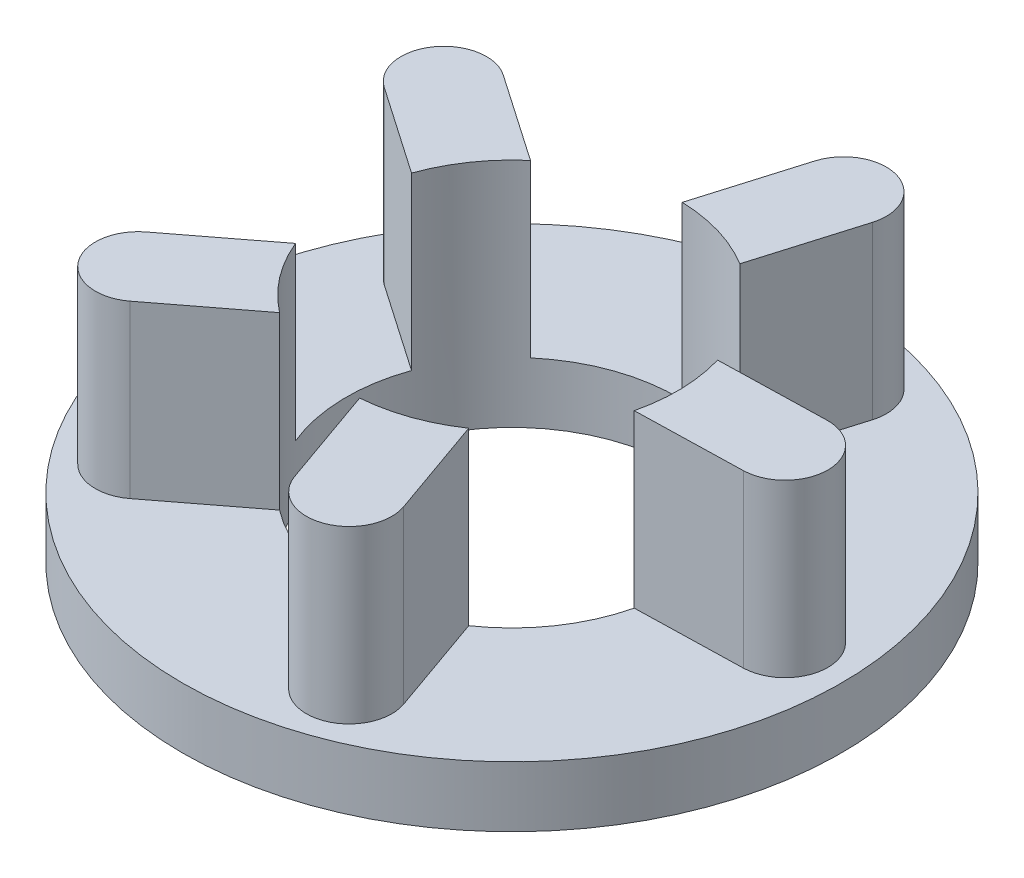
ISO-10303-21;
HEADER;
FILE_DESCRIPTION(('STEP AP214'),'2;1');
FILE_NAME('part.step','',(''),(''),'','','');
FILE_SCHEMA(('AUTOMOTIVE_DESIGN { 1 0 10303 214 1 1 1 1 }'));
ENDSEC;
DATA;
#1=APPLICATION_CONTEXT('core data for automotive mechanical design processes');
#2=APPLICATION_PROTOCOL_DEFINITION('international standard','automotive_design',2000,#1);
#3=PRODUCT_CONTEXT('',#1,'mechanical');
#4=PRODUCT('Part','Part','',(#3));
#5=PRODUCT_RELATED_PRODUCT_CATEGORY('part','',(#4));
#6=PRODUCT_DEFINITION_FORMATION('','',#4);
#7=PRODUCT_DEFINITION_CONTEXT('part definition',#1,'design');
#8=PRODUCT_DEFINITION('design','',#6,#7);
#9=PRODUCT_DEFINITION_SHAPE('','',#8);
#10=(LENGTH_UNIT() NAMED_UNIT(*) SI_UNIT(.MILLI.,.METRE.));
#11=(NAMED_UNIT(*) PLANE_ANGLE_UNIT() SI_UNIT($,.RADIAN.));
#12=(NAMED_UNIT(*) SI_UNIT($,.STERADIAN.) SOLID_ANGLE_UNIT());
#13=UNCERTAINTY_MEASURE_WITH_UNIT(LENGTH_MEASURE(1.E-05),#10,'distance_accuracy_value','');
#14=(GEOMETRIC_REPRESENTATION_CONTEXT(3) GLOBAL_UNCERTAINTY_ASSIGNED_CONTEXT((#13)) GLOBAL_UNIT_ASSIGNED_CONTEXT((#10,
#11,#12)) REPRESENTATION_CONTEXT('',''));
#15=CARTESIAN_POINT('',(0.,0.,0.));
#16=DIRECTION('',(0.,0.,1.));
#17=DIRECTION('',(1.,0.,0.));
#18=AXIS2_PLACEMENT_3D('',#15,#16,#17);
#19=CARTESIAN_POINT('',(-0.729172585778251,4.8,-0.953051593645096));
#20=DIRECTION('',(-0.607643821481876,0.,-0.794209661370914));
#21=DIRECTION('',(-0.794209661370914,0.,0.607643821481876));
#22=AXIS2_PLACEMENT_3D('',#19,#20,#21);
#23=PLANE('',#22);
#24=DIRECTION('',(0.794209661370914,0.,-0.607643821481876));
#25=VECTOR('',#24,1.);
#26=CARTESIAN_POINT('',(-0.729172585778251,0.,-0.953051593645096));
#27=LINE('',#26,#25);
#28=CARTESIAN_POINT('',(-6.67256688237728,0.,3.59419455383332));
#29=VERTEX_POINT('',#28);
#30=CARTESIAN_POINT('',(-4.29715451738641,0.,1.77678447024551));
#31=VERTEX_POINT('',#30);
#32=EDGE_CURVE('E356',#29,#31,#27,.T.);
#33=ORIENTED_EDGE('',*,*,#32,.F.);
#34=DIRECTION('',(0.,-1.,0.));
#35=VECTOR('',#34,1.);
#36=CARTESIAN_POINT('',(-6.67256688237728,4.8,3.59419455383332));
#37=LINE('',#36,#35);
#38=CARTESIAN_POINT('',(-6.67256688237728,4.8,3.59419455383332));
#39=VERTEX_POINT('',#38);
#40=EDGE_CURVE('E11',#39,#29,#37,.T.);
#41=ORIENTED_EDGE('',*,*,#40,.F.);
#42=DIRECTION('',(0.794209661370914,0.,-0.607643821481876));
#43=VECTOR('',#42,1.);
#44=CARTESIAN_POINT('',(-0.729172585778251,4.8,-0.953051593645096));
#45=LINE('',#44,#43);
#46=CARTESIAN_POINT('',(-4.29715451738641,4.8,1.77678447024551));
#47=VERTEX_POINT('',#46);
#48=EDGE_CURVE('E365',#39,#47,#45,.T.);
#49=ORIENTED_EDGE('',*,*,#48,.T.);
#50=DIRECTION('',(0.,-1.,0.));
#51=VECTOR('',#50,1.);
#52=CARTESIAN_POINT('',(-4.29715451738641,4.8,1.77678447024551));
#53=LINE('',#52,#51);
#54=EDGE_CURVE('E380',#47,#31,#53,.T.);
#55=ORIENTED_EDGE('',*,*,#54,.T.);
#56=EDGE_LOOP('',(#33,#41,#49,#55));
#57=FACE_BOUND('',#56,.T.);
#58=ADVANCED_FACE('F45',(#57),#23,.T.);
#59=CARTESIAN_POINT('',(-5.94339429659903,4.8,4.54724614747841));
#60=DIRECTION('',(0.,-1.,0.));
#61=DIRECTION('',(0.,0.,-1.));
#62=AXIS2_PLACEMENT_3D('',#59,#60,#61);
#63=CYLINDRICAL_SURFACE('',#62,1.2);
#64=CARTESIAN_POINT('',(-5.94339429659903,0.,4.54724614747841));
#65=DIRECTION('',(0.,1.,0.));
#66=DIRECTION('',(0.,0.,1.));
#67=AXIS2_PLACEMENT_3D('',#64,#65,#66);
#68=CIRCLE('',#67,1.2);
#69=CARTESIAN_POINT('',(-5.21422171082078,0.,5.50029774112351));
#70=VERTEX_POINT('',#69);
#71=EDGE_CURVE('E384',#29,#70,#68,.T.);
#72=ORIENTED_EDGE('',*,*,#71,.T.);
#73=DIRECTION('',(0.,-1.,0.));
#74=VECTOR('',#73,1.);
#75=CARTESIAN_POINT('',(-5.21422171082078,4.8,5.50029774112351));
#76=LINE('',#75,#74);
#77=CARTESIAN_POINT('',(-5.21422171082078,4.8,5.50029774112351));
#78=VERTEX_POINT('',#77);
#79=EDGE_CURVE('E53',#78,#70,#76,.T.);
#80=ORIENTED_EDGE('',*,*,#79,.F.);
#81=CARTESIAN_POINT('',(-5.94339429659903,4.8,4.54724614747841));
#82=DIRECTION('',(0.,1.,0.));
#83=DIRECTION('',(0.,0.,1.));
#84=AXIS2_PLACEMENT_3D('',#81,#82,#83);
#85=CIRCLE('',#84,1.2);
#86=EDGE_CURVE('E369',#39,#78,#85,.T.);
#87=ORIENTED_EDGE('',*,*,#86,.F.);
#88=ORIENTED_EDGE('',*,*,#40,.T.);
#89=EDGE_LOOP('',(#72,#80,#87,#88));
#90=FACE_BOUND('',#89,.T.);
#91=ADVANCED_FACE('F406',(#90),#63,.T.);
#92=CARTESIAN_POINT('',(0.729172585778251,4.8,0.953051593645096));
#93=DIRECTION('',(-0.607643821481877,0.,-0.794209661370914));
#94=DIRECTION('',(-0.794209661370914,0.,0.607643821481877));
#95=AXIS2_PLACEMENT_3D('',#92,#93,#94);
#96=PLANE('',#95);
#97=DIRECTION('',(0.794209661370914,0.,-0.607643821481877));
#98=VECTOR('',#97,1.);
#99=CARTESIAN_POINT('',(0.729172585778251,0.,0.953051593645096));
#100=LINE('',#99,#98);
#101=CARTESIAN_POINT('',(-2.8388093458299,0.,3.6828876575357));
#102=VERTEX_POINT('',#101);
#103=EDGE_CURVE('E370',#70,#102,#100,.T.);
#104=ORIENTED_EDGE('',*,*,#103,.T.);
#105=DIRECTION('',(0.,-1.,0.));
#106=VECTOR('',#105,1.);
#107=CARTESIAN_POINT('',(-2.8388093458299,4.8,3.6828876575357));
#108=LINE('',#107,#106);
#109=CARTESIAN_POINT('',(-2.8388093458299,4.8,3.6828876575357));
#110=VERTEX_POINT('',#109);
#111=EDGE_CURVE('E394',#110,#102,#108,.T.);
#112=ORIENTED_EDGE('',*,*,#111,.F.);
#113=DIRECTION('',(0.794209661370914,0.,-0.607643821481877));
#114=VECTOR('',#113,1.);
#115=CARTESIAN_POINT('',(0.729172585778251,4.8,0.953051593645096));
#116=LINE('',#115,#114);
#117=EDGE_CURVE('E373',#78,#110,#116,.T.);
#118=ORIENTED_EDGE('',*,*,#117,.F.);
#119=ORIENTED_EDGE('',*,*,#79,.T.);
#120=EDGE_LOOP('',(#104,#112,#118,#119));
#121=FACE_BOUND('',#120,.T.);
#122=ADVANCED_FACE('F402',(#121),#96,.F.);
#123=CARTESIAN_POINT('',(0.,4.8,0.));
#124=DIRECTION('',(0.,-1.,0.));
#125=DIRECTION('',(0.,0.,-1.));
#126=AXIS2_PLACEMENT_3D('',#123,#124,#125);
#127=CYLINDRICAL_SURFACE('',#126,4.65);
#128=ORIENTED_EDGE('',*,*,#111,.T.);
#129=CARTESIAN_POINT('',(0.,0.,0.));
#130=DIRECTION('',(0.,1.,0.));
#131=DIRECTION('',(0.,0.,1.));
#132=AXIS2_PLACEMENT_3D('',#129,#130,#131);
#133=CIRCLE('',#132,4.65);
#134=CARTESIAN_POINT('',(0.361928675151548,0.,4.63589340193485));
#135=VERTEX_POINT('',#134);
#136=EDGE_CURVE('E357',#102,#135,#133,.T.);
#137=ORIENTED_EDGE('',*,*,#136,.T.);
#138=DIRECTION('',(0.,-1.,0.));
#139=VECTOR('',#138,1.);
#140=CARTESIAN_POINT('',(0.361928675151548,4.8,4.63589340193485));
#141=LINE('',#140,#139);
#142=CARTESIAN_POINT('',(0.361928675151548,4.8,4.63589340193485));
#143=VERTEX_POINT('',#142);
#144=EDGE_CURVE('E221',#143,#135,#141,.T.);
#145=ORIENTED_EDGE('',*,*,#144,.F.);
#146=CARTESIAN_POINT('',(0.,4.8,0.));
#147=DIRECTION('',(0.,1.,0.));
#148=DIRECTION('',(0.,0.,1.));
#149=AXIS2_PLACEMENT_3D('',#146,#147,#148);
#150=CIRCLE('',#149,4.65);
#151=CARTESIAN_POINT('',(2.62539397383045,4.8,3.83794300142339));
#152=VERTEX_POINT('',#151);
#153=EDGE_CURVE('E210',#143,#152,#150,.T.);
#154=ORIENTED_EDGE('',*,*,#153,.T.);
#155=DIRECTION('',(0.,-1.,0.));
#156=VECTOR('',#155,1.);
#157=CARTESIAN_POINT('',(2.62539397383045,4.8,3.83794300142339));
#158=LINE('',#157,#156);
#159=CARTESIAN_POINT('',(2.62539397383045,0.,3.83794300142339));
#160=VERTEX_POINT('',#159);
#161=EDGE_CURVE('E228',#152,#160,#158,.T.);
#162=ORIENTED_EDGE('',*,*,#161,.T.);
#163=CARTESIAN_POINT('',(4.52083874013328,0.,1.08835522037161));
#164=VERTEX_POINT('',#163);
#165=EDGE_CURVE('E361',#160,#164,#133,.T.);
#166=ORIENTED_EDGE('',*,*,#165,.T.);
#167=DIRECTION('',(0.,-1.,0.));
#168=VECTOR('',#167,1.);
#169=CARTESIAN_POINT('',(4.52083874013328,4.8,1.08835522037161));
#170=LINE('',#169,#168);
#171=CARTESIAN_POINT('',(4.52083874013328,4.8,1.08835522037161));
#172=VERTEX_POINT('',#171);
#173=EDGE_CURVE('E247',#172,#164,#170,.T.);
#174=ORIENTED_EDGE('',*,*,#173,.F.);
#175=CARTESIAN_POINT('',(0.,4.8,0.));
#176=DIRECTION('',(0.,1.,0.));
#177=DIRECTION('',(0.,0.,1.));
#178=AXIS2_PLACEMENT_3D('',#175,#176,#177);
#179=CIRCLE('',#178,4.65);
#180=CARTESIAN_POINT('',(4.46139205551628,4.8,-1.31090843577126));
#181=VERTEX_POINT('',#180);
#182=EDGE_CURVE('E243',#172,#181,#179,.T.);
#183=ORIENTED_EDGE('',*,*,#182,.T.);
#184=DIRECTION('',(0.,-1.,0.));
#185=VECTOR('',#184,1.);
#186=CARTESIAN_POINT('',(4.46139205551628,4.8,-1.31090843577126));
#187=LINE('',#186,#185);
#188=CARTESIAN_POINT('',(4.46139205551628,0.,-1.31090843577126));
#189=VERTEX_POINT('',#188);
#190=EDGE_CURVE('E259',#181,#189,#187,.T.);
#191=ORIENTED_EDGE('',*,*,#190,.T.);
#192=CARTESIAN_POINT('',(2.43210332390807,0.,-3.96325288391181));
#193=VERTEX_POINT('',#192);
#194=EDGE_CURVE('E741',#189,#193,#133,.T.);
#195=ORIENTED_EDGE('',*,*,#194,.T.);
#196=DIRECTION('',(0.,-1.,0.));
#197=VECTOR('',#196,1.);
#198=CARTESIAN_POINT('',(2.43210332390807,4.8,-3.96325288391181));
#199=LINE('',#198,#197);
#200=CARTESIAN_POINT('',(2.43210332390807,4.8,-3.96325288391181));
#201=VERTEX_POINT('',#200);
#202=EDGE_CURVE('E284',#201,#193,#199,.T.);
#203=ORIENTED_EDGE('',*,*,#202,.F.);
#204=CARTESIAN_POINT('',(0.,4.8,0.));
#205=DIRECTION('',(0.,1.,0.));
#206=DIRECTION('',(0.,0.,1.));
#207=AXIS2_PLACEMENT_3D('',#204,#205,#206);
#208=CIRCLE('',#207,4.65);
#209=CARTESIAN_POINT('',(0.131897953617362,4.8,-4.64812897086898));
#210=VERTEX_POINT('',#209);
#211=EDGE_CURVE('E280',#201,#210,#208,.T.);
#212=ORIENTED_EDGE('',*,*,#211,.T.);
#213=DIRECTION('',(0.,-1.,0.));
#214=VECTOR('',#213,1.);
#215=CARTESIAN_POINT('',(0.131897953617362,4.8,-4.64812897086898));
#216=LINE('',#215,#214);
#217=CARTESIAN_POINT('',(0.131897953617362,0.,-4.64812897086898));
#218=VERTEX_POINT('',#217);
#219=EDGE_CURVE('E296',#210,#218,#216,.T.);
#220=ORIENTED_EDGE('',*,*,#219,.T.);
#221=CARTESIAN_POINT('',(-3.0177162218065,0.,-3.53778020864015));
#222=VERTEX_POINT('',#221);
#223=EDGE_CURVE('E743',#218,#222,#133,.T.);
#224=ORIENTED_EDGE('',*,*,#223,.T.);
#225=DIRECTION('',(0.,-1.,0.));
#226=VECTOR('',#225,1.);
#227=CARTESIAN_POINT('',(-3.0177162218065,4.8,-3.53778020864015));
#228=LINE('',#227,#226);
#229=CARTESIAN_POINT('',(-3.0177162218065,4.8,-3.53778020864015));
#230=VERTEX_POINT('',#229);
#231=EDGE_CURVE('E323',#230,#222,#228,.T.);
#232=ORIENTED_EDGE('',*,*,#231,.F.);
#233=CARTESIAN_POINT('',(0.,4.8,0.));
#234=DIRECTION('',(0.,1.,0.));
#235=DIRECTION('',(0.,0.,1.));
#236=AXIS2_PLACEMENT_3D('',#233,#234,#235);
#237=CIRCLE('',#236,4.65);
#238=CARTESIAN_POINT('',(-4.37987463713419,4.8,-1.56179325231884));
#239=VERTEX_POINT('',#238);
#240=EDGE_CURVE('E319',#230,#239,#237,.T.);
#241=ORIENTED_EDGE('',*,*,#240,.T.);
#242=DIRECTION('',(0.,-1.,0.));
#243=VECTOR('',#242,1.);
#244=CARTESIAN_POINT('',(-4.37987463713419,4.8,-1.56179325231884));
#245=LINE('',#244,#243);
#246=CARTESIAN_POINT('',(-4.37987463713419,0.,-1.56179325231884));
#247=VERTEX_POINT('',#246);
#248=EDGE_CURVE('E335',#239,#247,#245,.T.);
#249=ORIENTED_EDGE('',*,*,#248,.T.);
#250=EDGE_CURVE('E346',#247,#31,#133,.T.);
#251=ORIENTED_EDGE('',*,*,#250,.T.);
#252=ORIENTED_EDGE('',*,*,#54,.F.);
#253=CARTESIAN_POINT('',(0.,4.8,0.));
#254=DIRECTION('',(0.,1.,0.));
#255=DIRECTION('',(0.,0.,1.));
#256=AXIS2_PLACEMENT_3D('',#253,#254,#255);
#257=CIRCLE('',#256,4.65);
#258=EDGE_CURVE('E376',#47,#110,#257,.T.);
#259=ORIENTED_EDGE('',*,*,#258,.T.);
#260=EDGE_LOOP('',(#128,#137,#145,#154,#162,#166,#174,#183,#191,#195,#203,#212,#220,#224,#232,
#241,#249,#251,#252,#259));
#261=FACE_BOUND('',#260,.T.);
#262=CARTESIAN_POINT('',(0.,-1.7,0.));
#263=DIRECTION('',(0.,1.,0.));
#264=DIRECTION('',(0.,0.,1.));
#265=AXIS2_PLACEMENT_3D('',#262,#263,#264);
#266=CIRCLE('',#265,4.65);
#267=CARTESIAN_POINT('',(0.,-1.7,4.65));
#268=VERTEX_POINT('',#267);
#269=EDGE_CURVE('E347',#268,#268,#266,.T.);
#270=ORIENTED_EDGE('',*,*,#269,.F.);
#271=EDGE_LOOP('',(#270));
#272=FACE_BOUND('',#271,.T.);
#273=ADVANCED_FACE('F414',(#261,#272),#127,.F.);
#274=CARTESIAN_POINT('',(0.,4.8,0.));
#275=DIRECTION('',(0.,1.,0.));
#276=DIRECTION('',(0.,0.,1.));
#277=AXIS2_PLACEMENT_3D('',#274,#275,#276);
#278=PLANE('',#277);
#279=ORIENTED_EDGE('',*,*,#48,.F.);
#280=ORIENTED_EDGE('',*,*,#86,.T.);
#281=ORIENTED_EDGE('',*,*,#117,.T.);
#282=ORIENTED_EDGE('',*,*,#258,.F.);
#283=EDGE_LOOP('',(#279,#280,#281,#282));
#284=FACE_BOUND('',#283,.T.);
#285=ADVANCED_FACE('F418',(#284),#278,.T.);
#286=CARTESIAN_POINT('',(0.,0.,0.));
#287=DIRECTION('',(0.,1.,0.));
#288=DIRECTION('',(0.,0.,1.));
#289=AXIS2_PLACEMENT_3D('',#286,#287,#288);
#290=PLANE('',#289);
#291=DIRECTION('',(-0.332479333546443,0.,-0.943110541116211));
#292=VECTOR('',#291,1.);
#293=CARTESIAN_POINT('',(-1.13173264933946,0.,0.398975200255733));
#294=LINE('',#293,#292);
#295=CARTESIAN_POINT('',(1.35634558849769,0.,7.45665541212453));
#296=VERTEX_POINT('',#295);
#297=EDGE_CURVE('E193',#296,#135,#294,.T.);
#298=ORIENTED_EDGE('',*,*,#297,.T.);
#299=ORIENTED_EDGE('',*,*,#136,.F.);
#300=ORIENTED_EDGE('',*,*,#103,.F.);
#301=ORIENTED_EDGE('',*,*,#71,.F.);
#302=ORIENTED_EDGE('',*,*,#32,.T.);
#303=ORIENTED_EDGE('',*,*,#250,.F.);
#304=DIRECTION('',(0.823327898467212,0.,0.567566006386538));
#305=VECTOR('',#304,1.);
#306=CARTESIAN_POINT('',(-0.681079207663845,0.,0.987993478160653));
#307=LINE('',#306,#305);
#308=CARTESIAN_POINT('',(-6.84237712934146,0.,-3.25933405935446));
#309=VERTEX_POINT('',#308);
#310=EDGE_CURVE('E313',#309,#247,#307,.T.);
#311=ORIENTED_EDGE('',*,*,#310,.F.);
#312=CARTESIAN_POINT('',(-6.16129792167762,0.,-4.24732753751512));
#313=DIRECTION('',(0.,1.,0.));
#314=DIRECTION('',(0.,0.,1.));
#315=AXIS2_PLACEMENT_3D('',#312,#313,#314);
#316=CIRCLE('',#315,1.2);
#317=CARTESIAN_POINT('',(-5.48021871401377,0.,-5.23532101567577));
#318=VERTEX_POINT('',#317);
#319=EDGE_CURVE('E327',#318,#309,#316,.T.);
#320=ORIENTED_EDGE('',*,*,#319,.F.);
#321=DIRECTION('',(0.823327898467212,0.,0.567566006386538));
#322=VECTOR('',#321,1.);
#323=CARTESIAN_POINT('',(0.681079207663846,0.,-0.987993478160655));
#324=LINE('',#323,#322);
#325=EDGE_CURVE('E307',#318,#222,#324,.T.);
#326=ORIENTED_EDGE('',*,*,#325,.T.);
#327=ORIENTED_EDGE('',*,*,#223,.F.);
#328=DIRECTION('',(-0.285365036232154,0.,0.958418904287797));
#329=VECTOR('',#328,1.);
#330=CARTESIAN_POINT('',(-1.15010268514535,0.,-0.342438043478584));
#331=LINE('',#330,#329);
#332=CARTESIAN_POINT('',(0.98540008104282,0.,-7.51467697049474));
#333=VERTEX_POINT('',#332);
#334=EDGE_CURVE('E274',#333,#218,#331,.T.);
#335=ORIENTED_EDGE('',*,*,#334,.F.);
#336=CARTESIAN_POINT('',(2.13550276618817,0.,-7.17223892701615));
#337=DIRECTION('',(0.,1.,0.));
#338=DIRECTION('',(0.,0.,1.));
#339=AXIS2_PLACEMENT_3D('',#336,#337,#338);
#340=CIRCLE('',#339,1.2);
#341=CARTESIAN_POINT('',(3.28560545133353,0.,-6.82980088353757));
#342=VERTEX_POINT('',#341);
#343=EDGE_CURVE('E288',#342,#333,#340,.T.);
#344=ORIENTED_EDGE('',*,*,#343,.F.);
#345=DIRECTION('',(-0.285365036232154,0.,0.958418904287797));
#346=VECTOR('',#345,1.);
#347=CARTESIAN_POINT('',(1.15010268514536,0.,0.342438043478585));
#348=LINE('',#347,#346);
#349=EDGE_CURVE('E268',#342,#193,#348,.T.);
#350=ORIENTED_EDGE('',*,*,#349,.T.);
#351=ORIENTED_EDGE('',*,*,#194,.F.);
#352=DIRECTION('',(-0.999693190059529,0.,0.024769451923753));
#353=VECTOR('',#352,1.);
#354=CARTESIAN_POINT('',(-0.0297233423085035,0.,-1.19963182807143));
#355=LINE('',#354,#353);
#356=CARTESIAN_POINT('',(7.45138787194283,0.,-1.38499172288737));
#357=VERTEX_POINT('',#356);
#358=EDGE_CURVE('E68',#357,#189,#355,.T.);
#359=ORIENTED_EDGE('',*,*,#358,.F.);
#360=CARTESIAN_POINT('',(7.48111121425133,0.,-0.185359894815941));
#361=DIRECTION('',(0.,1.,0.));
#362=DIRECTION('',(0.,0.,1.));
#363=AXIS2_PLACEMENT_3D('',#360,#361,#362);
#364=CIRCLE('',#363,1.2);
#365=CARTESIAN_POINT('',(7.51083455655983,0.,1.0142719332555));
#366=VERTEX_POINT('',#365);
#367=EDGE_CURVE('E251',#366,#357,#364,.T.);
#368=ORIENTED_EDGE('',*,*,#367,.F.);
#369=DIRECTION('',(-0.999693190059529,0.,0.0247694519237526));
#370=VECTOR('',#369,1.);
#371=CARTESIAN_POINT('',(0.0297233423085032,0.,1.19963182807144));
#372=LINE('',#371,#370);
#373=EDGE_CURVE('E197',#366,#164,#372,.T.);
#374=ORIENTED_EDGE('',*,*,#373,.T.);
#375=ORIENTED_EDGE('',*,*,#165,.F.);
#376=DIRECTION('',(-0.332479333546443,0.,-0.943110541116212));
#377=VECTOR('',#376,1.);
#378=CARTESIAN_POINT('',(1.13173264933945,0.,-0.398975200255731));
#379=LINE('',#378,#377);
#380=CARTESIAN_POINT('',(3.61981088717659,0.,6.65870501161306));
#381=VERTEX_POINT('',#380);
#382=EDGE_CURVE('E60',#381,#160,#379,.T.);
#383=ORIENTED_EDGE('',*,*,#382,.F.);
#384=CARTESIAN_POINT('',(2.48807823783714,0.,7.05768021186879));
#385=DIRECTION('',(0.,1.,0.));
#386=DIRECTION('',(0.,0.,1.));
#387=AXIS2_PLACEMENT_3D('',#384,#385,#386);
#388=CIRCLE('',#387,1.2);
#389=EDGE_CURVE('E214',#296,#381,#388,.T.);
#390=ORIENTED_EDGE('',*,*,#389,.F.);
#391=EDGE_LOOP('',(#298,#299,#300,#301,#302,#303,#311,#320,#326,#327,#335,#344,#350,#351,#359,
#368,#374,#375,#383,#390));
#392=FACE_BOUND('',#391,.T.);
#393=CARTESIAN_POINT('',(0.,0.,0.));
#394=DIRECTION('',(0.,1.,0.));
#395=DIRECTION('',(0.,0.,1.));
#396=AXIS2_PLACEMENT_3D('',#393,#394,#395);
#397=CIRCLE('',#396,9.25);
#398=CARTESIAN_POINT('',(0.,0.,9.25));
#399=VERTEX_POINT('',#398);
#400=EDGE_CURVE('E352',#399,#399,#397,.T.);
#401=ORIENTED_EDGE('',*,*,#400,.T.);
#402=EDGE_LOOP('',(#401));
#403=FACE_BOUND('',#402,.T.);
#404=ADVANCED_FACE('F410',(#392,#403),#290,.T.);
#405=CARTESIAN_POINT('',(0.,-1.7,0.));
#406=DIRECTION('',(0.,1.,0.));
#407=DIRECTION('',(0.,0.,1.));
#408=AXIS2_PLACEMENT_3D('',#405,#406,#407);
#409=CYLINDRICAL_SURFACE('',#408,9.25);
#410=CARTESIAN_POINT('',(0.,-1.7,0.));
#411=DIRECTION('',(0.,1.,0.));
#412=DIRECTION('',(0.,0.,1.));
#413=AXIS2_PLACEMENT_3D('',#410,#411,#412);
#414=CIRCLE('',#413,9.25);
#415=CARTESIAN_POINT('',(0.,-1.7,9.25));
#416=VERTEX_POINT('',#415);
#417=EDGE_CURVE('E351',#416,#416,#414,.T.);
#418=ORIENTED_EDGE('',*,*,#417,.T.);
#419=EDGE_LOOP('',(#418));
#420=FACE_BOUND('',#419,.T.);
#421=ORIENTED_EDGE('',*,*,#400,.F.);
#422=EDGE_LOOP('',(#421));
#423=FACE_BOUND('',#422,.T.);
#424=ADVANCED_FACE('F433',(#420,#423),#409,.T.);
#425=CARTESIAN_POINT('',(0.,-1.7,0.));
#426=DIRECTION('',(0.,1.,0.));
#427=DIRECTION('',(0.,0.,1.));
#428=AXIS2_PLACEMENT_3D('',#425,#426,#427);
#429=PLANE('',#428);
#430=ORIENTED_EDGE('',*,*,#269,.T.);
#431=EDGE_LOOP('',(#430));
#432=FACE_BOUND('',#431,.T.);
#433=ORIENTED_EDGE('',*,*,#417,.F.);
#434=EDGE_LOOP('',(#433));
#435=FACE_BOUND('',#434,.T.);
#436=ADVANCED_FACE('F436',(#432,#435),#429,.F.);
#437=CARTESIAN_POINT('',(0.681079207663846,4.8,-0.987993478160655));
#438=DIRECTION('',(0.567566006386538,0.,-0.823327898467212));
#439=DIRECTION('',(-0.823327898467212,0.,-0.567566006386538));
#440=AXIS2_PLACEMENT_3D('',#437,#438,#439);
#441=PLANE('',#440);
#442=ORIENTED_EDGE('',*,*,#325,.F.);
#443=DIRECTION('',(0.,-1.,0.));
#444=VECTOR('',#443,1.);
#445=CARTESIAN_POINT('',(-5.48021871401377,4.8,-5.23532101567577));
#446=LINE('',#445,#444);
#447=CARTESIAN_POINT('',(-5.48021871401377,4.8,-5.23532101567577));
#448=VERTEX_POINT('',#447);
#449=EDGE_CURVE('E343',#448,#318,#446,.T.);
#450=ORIENTED_EDGE('',*,*,#449,.F.);
#451=DIRECTION('',(0.823327898467212,0.,0.567566006386538));
#452=VECTOR('',#451,1.);
#453=CARTESIAN_POINT('',(0.681079207663846,4.8,-0.987993478160655));
#454=LINE('',#453,#452);
#455=EDGE_CURVE('E308',#448,#230,#454,.T.);
#456=ORIENTED_EDGE('',*,*,#455,.T.);
#457=ORIENTED_EDGE('',*,*,#231,.T.);
#458=EDGE_LOOP('',(#442,#450,#456,#457));
#459=FACE_BOUND('',#458,.T.);
#460=ADVANCED_FACE('F442',(#459),#441,.T.);
#461=CARTESIAN_POINT('',(-6.16129792167762,4.8,-4.24732753751512));
#462=DIRECTION('',(0.,-1.,0.));
#463=DIRECTION('',(0.,0.,-1.));
#464=AXIS2_PLACEMENT_3D('',#461,#462,#463);
#465=CYLINDRICAL_SURFACE('',#464,1.2);
#466=ORIENTED_EDGE('',*,*,#319,.T.);
#467=DIRECTION('',(0.,-1.,0.));
#468=VECTOR('',#467,1.);
#469=CARTESIAN_POINT('',(-6.84237712934146,4.8,-3.25933405935446));
#470=LINE('',#469,#468);
#471=CARTESIAN_POINT('',(-6.84237712934146,4.8,-3.25933405935446));
#472=VERTEX_POINT('',#471);
#473=EDGE_CURVE('E339',#472,#309,#470,.T.);
#474=ORIENTED_EDGE('',*,*,#473,.F.);
#475=CARTESIAN_POINT('',(-6.16129792167762,4.8,-4.24732753751512));
#476=DIRECTION('',(0.,1.,0.));
#477=DIRECTION('',(0.,0.,1.));
#478=AXIS2_PLACEMENT_3D('',#475,#476,#477);
#479=CIRCLE('',#478,1.2);
#480=EDGE_CURVE('E312',#448,#472,#479,.T.);
#481=ORIENTED_EDGE('',*,*,#480,.F.);
#482=ORIENTED_EDGE('',*,*,#449,.T.);
#483=EDGE_LOOP('',(#466,#474,#481,#482));
#484=FACE_BOUND('',#483,.T.);
#485=ADVANCED_FACE('F446',(#484),#465,.T.);
#486=CARTESIAN_POINT('',(-0.681079207663845,4.8,0.987993478160653));
#487=DIRECTION('',(0.567566006386538,0.,-0.823327898467212));
#488=DIRECTION('',(-0.823327898467212,0.,-0.567566006386538));
#489=AXIS2_PLACEMENT_3D('',#486,#487,#488);
#490=PLANE('',#489);
#491=ORIENTED_EDGE('',*,*,#310,.T.);
#492=ORIENTED_EDGE('',*,*,#248,.F.);
#493=DIRECTION('',(0.823327898467212,0.,0.567566006386538));
#494=VECTOR('',#493,1.);
#495=CARTESIAN_POINT('',(-0.681079207663845,4.8,0.987993478160653));
#496=LINE('',#495,#494);
#497=EDGE_CURVE('E316',#472,#239,#496,.T.);
#498=ORIENTED_EDGE('',*,*,#497,.F.);
#499=ORIENTED_EDGE('',*,*,#473,.T.);
#500=EDGE_LOOP('',(#491,#492,#498,#499));
#501=FACE_BOUND('',#500,.T.);
#502=ADVANCED_FACE('F450',(#501),#490,.F.);
#503=CARTESIAN_POINT('',(0.,4.8,0.));
#504=DIRECTION('',(0.,1.,0.));
#505=DIRECTION('',(0.,0.,1.));
#506=AXIS2_PLACEMENT_3D('',#503,#504,#505);
#507=PLANE('',#506);
#508=ORIENTED_EDGE('',*,*,#455,.F.);
#509=ORIENTED_EDGE('',*,*,#480,.T.);
#510=ORIENTED_EDGE('',*,*,#497,.T.);
#511=ORIENTED_EDGE('',*,*,#240,.F.);
#512=EDGE_LOOP('',(#508,#509,#510,#511));
#513=FACE_BOUND('',#512,.T.);
#514=ADVANCED_FACE('F454',(#513),#507,.T.);
#515=CARTESIAN_POINT('',(1.15010268514536,4.8,0.342438043478585));
#516=DIRECTION('',(0.958418904287797,0.,0.285365036232154));
#517=DIRECTION('',(0.285365036232154,0.,-0.958418904287797));
#518=AXIS2_PLACEMENT_3D('',#515,#516,#517);
#519=PLANE('',#518);
#520=ORIENTED_EDGE('',*,*,#349,.F.);
#521=DIRECTION('',(0.,-1.,0.));
#522=VECTOR('',#521,1.);
#523=CARTESIAN_POINT('',(3.28560545133353,4.8,-6.82980088353757));
#524=LINE('',#523,#522);
#525=CARTESIAN_POINT('',(3.28560545133353,4.8,-6.82980088353757));
#526=VERTEX_POINT('',#525);
#527=EDGE_CURVE('E304',#526,#342,#524,.T.);
#528=ORIENTED_EDGE('',*,*,#527,.F.);
#529=DIRECTION('',(-0.285365036232154,0.,0.958418904287797));
#530=VECTOR('',#529,1.);
#531=CARTESIAN_POINT('',(1.15010268514536,4.8,0.342438043478585));
#532=LINE('',#531,#530);
#533=EDGE_CURVE('E269',#526,#201,#532,.T.);
#534=ORIENTED_EDGE('',*,*,#533,.T.);
#535=ORIENTED_EDGE('',*,*,#202,.T.);
#536=EDGE_LOOP('',(#520,#528,#534,#535));
#537=FACE_BOUND('',#536,.T.);
#538=ADVANCED_FACE('F458',(#537),#519,.T.);
#539=CARTESIAN_POINT('',(2.13550276618817,4.8,-7.17223892701615));
#540=DIRECTION('',(0.,-1.,0.));
#541=DIRECTION('',(0.,0.,-1.));
#542=AXIS2_PLACEMENT_3D('',#539,#540,#541);
#543=CYLINDRICAL_SURFACE('',#542,1.2);
#544=ORIENTED_EDGE('',*,*,#343,.T.);
#545=DIRECTION('',(0.,-1.,0.));
#546=VECTOR('',#545,1.);
#547=CARTESIAN_POINT('',(0.98540008104282,4.8,-7.51467697049474));
#548=LINE('',#547,#546);
#549=CARTESIAN_POINT('',(0.98540008104282,4.8,-7.51467697049474));
#550=VERTEX_POINT('',#549);
#551=EDGE_CURVE('E300',#550,#333,#548,.T.);
#552=ORIENTED_EDGE('',*,*,#551,.F.);
#553=CARTESIAN_POINT('',(2.13550276618817,4.8,-7.17223892701615));
#554=DIRECTION('',(0.,1.,0.));
#555=DIRECTION('',(0.,0.,1.));
#556=AXIS2_PLACEMENT_3D('',#553,#554,#555);
#557=CIRCLE('',#556,1.2);
#558=EDGE_CURVE('E273',#526,#550,#557,.T.);
#559=ORIENTED_EDGE('',*,*,#558,.F.);
#560=ORIENTED_EDGE('',*,*,#527,.T.);
#561=EDGE_LOOP('',(#544,#552,#559,#560));
#562=FACE_BOUND('',#561,.T.);
#563=ADVANCED_FACE('F462',(#562),#543,.T.);
#564=CARTESIAN_POINT('',(-1.15010268514535,4.8,-0.342438043478584));
#565=DIRECTION('',(0.958418904287797,0.,0.285365036232154));
#566=DIRECTION('',(0.285365036232154,0.,-0.958418904287797));
#567=AXIS2_PLACEMENT_3D('',#564,#565,#566);
#568=PLANE('',#567);
#569=ORIENTED_EDGE('',*,*,#334,.T.);
#570=ORIENTED_EDGE('',*,*,#219,.F.);
#571=DIRECTION('',(-0.285365036232154,0.,0.958418904287797));
#572=VECTOR('',#571,1.);
#573=CARTESIAN_POINT('',(-1.15010268514535,4.8,-0.342438043478584));
#574=LINE('',#573,#572);
#575=EDGE_CURVE('E277',#550,#210,#574,.T.);
#576=ORIENTED_EDGE('',*,*,#575,.F.);
#577=ORIENTED_EDGE('',*,*,#551,.T.);
#578=EDGE_LOOP('',(#569,#570,#576,#577));
#579=FACE_BOUND('',#578,.T.);
#580=ADVANCED_FACE('F466',(#579),#568,.F.);
#581=CARTESIAN_POINT('',(0.,4.8,0.));
#582=DIRECTION('',(0.,1.,0.));
#583=DIRECTION('',(0.,0.,1.));
#584=AXIS2_PLACEMENT_3D('',#581,#582,#583);
#585=PLANE('',#584);
#586=ORIENTED_EDGE('',*,*,#533,.F.);
#587=ORIENTED_EDGE('',*,*,#558,.T.);
#588=ORIENTED_EDGE('',*,*,#575,.T.);
#589=ORIENTED_EDGE('',*,*,#211,.F.);
#590=EDGE_LOOP('',(#586,#587,#588,#589));
#591=FACE_BOUND('',#590,.T.);
#592=ADVANCED_FACE('F470',(#591),#585,.T.);
#593=CARTESIAN_POINT('',(0.0297233423085032,4.8,1.19963182807144));
#594=DIRECTION('',(0.0247694519237526,0.,0.999693190059529));
#595=DIRECTION('',(0.999693190059529,0.,-0.0247694519237526));
#596=AXIS2_PLACEMENT_3D('',#593,#594,#595);
#597=PLANE('',#596);
#598=ORIENTED_EDGE('',*,*,#373,.F.);
#599=DIRECTION('',(0.,-1.,0.));
#600=VECTOR('',#599,1.);
#601=CARTESIAN_POINT('',(7.51083455655983,4.8,1.0142719332555));
#602=LINE('',#601,#600);
#603=CARTESIAN_POINT('',(7.51083455655983,4.8,1.0142719332555));
#604=VERTEX_POINT('',#603);
#605=EDGE_CURVE('E265',#604,#366,#602,.T.);
#606=ORIENTED_EDGE('',*,*,#605,.F.);
#607=DIRECTION('',(-0.999693190059529,0.,0.0247694519237526));
#608=VECTOR('',#607,1.);
#609=CARTESIAN_POINT('',(0.0297233423085032,4.8,1.19963182807144));
#610=LINE('',#609,#608);
#611=EDGE_CURVE('E233',#604,#172,#610,.T.);
#612=ORIENTED_EDGE('',*,*,#611,.T.);
#613=ORIENTED_EDGE('',*,*,#173,.T.);
#614=EDGE_LOOP('',(#598,#606,#612,#613));
#615=FACE_BOUND('',#614,.T.);
#616=ADVANCED_FACE('F474',(#615),#597,.T.);
#617=CARTESIAN_POINT('',(7.48111121425133,4.8,-0.185359894815941));
#618=DIRECTION('',(0.,-1.,0.));
#619=DIRECTION('',(0.,0.,-1.));
#620=AXIS2_PLACEMENT_3D('',#617,#618,#619);
#621=CYLINDRICAL_SURFACE('',#620,1.2);
#622=ORIENTED_EDGE('',*,*,#367,.T.);
#623=DIRECTION('',(0.,-1.,0.));
#624=VECTOR('',#623,1.);
#625=CARTESIAN_POINT('',(7.45138787194283,4.8,-1.38499172288737));
#626=LINE('',#625,#624);
#627=CARTESIAN_POINT('',(7.45138787194283,4.8,-1.38499172288737));
#628=VERTEX_POINT('',#627);
#629=EDGE_CURVE('E262',#628,#357,#626,.T.);
#630=ORIENTED_EDGE('',*,*,#629,.F.);
#631=CARTESIAN_POINT('',(7.48111121425133,4.8,-0.185359894815941));
#632=DIRECTION('',(0.,1.,0.));
#633=DIRECTION('',(0.,0.,1.));
#634=AXIS2_PLACEMENT_3D('',#631,#632,#633);
#635=CIRCLE('',#634,1.2);
#636=EDGE_CURVE('E237',#604,#628,#635,.T.);
#637=ORIENTED_EDGE('',*,*,#636,.F.);
#638=ORIENTED_EDGE('',*,*,#605,.T.);
#639=EDGE_LOOP('',(#622,#630,#637,#638));
#640=FACE_BOUND('',#639,.T.);
#641=ADVANCED_FACE('F478',(#640),#621,.T.);
#642=CARTESIAN_POINT('',(-0.0297233423085035,4.8,-1.19963182807143));
#643=DIRECTION('',(0.024769451923753,0.,0.999693190059529));
#644=DIRECTION('',(0.999693190059529,0.,-0.024769451923753));
#645=AXIS2_PLACEMENT_3D('',#642,#643,#644);
#646=PLANE('',#645);
#647=ORIENTED_EDGE('',*,*,#358,.T.);
#648=ORIENTED_EDGE('',*,*,#190,.F.);
#649=DIRECTION('',(-0.999693190059529,0.,0.024769451923753));
#650=VECTOR('',#649,1.);
#651=CARTESIAN_POINT('',(-0.0297233423085035,4.8,-1.19963182807143));
#652=LINE('',#651,#650);
#653=EDGE_CURVE('E240',#628,#181,#652,.T.);
#654=ORIENTED_EDGE('',*,*,#653,.F.);
#655=ORIENTED_EDGE('',*,*,#629,.T.);
#656=EDGE_LOOP('',(#647,#648,#654,#655));
#657=FACE_BOUND('',#656,.T.);
#658=ADVANCED_FACE('F482',(#657),#646,.F.);
#659=CARTESIAN_POINT('',(0.,4.8,0.));
#660=DIRECTION('',(0.,1.,0.));
#661=DIRECTION('',(0.,0.,1.));
#662=AXIS2_PLACEMENT_3D('',#659,#660,#661);
#663=PLANE('',#662);
#664=ORIENTED_EDGE('',*,*,#611,.F.);
#665=ORIENTED_EDGE('',*,*,#636,.T.);
#666=ORIENTED_EDGE('',*,*,#653,.T.);
#667=ORIENTED_EDGE('',*,*,#182,.F.);
#668=EDGE_LOOP('',(#664,#665,#666,#667));
#669=FACE_BOUND('',#668,.T.);
#670=ADVANCED_FACE('F486',(#669),#663,.T.);
#671=CARTESIAN_POINT('',(-1.13173264933946,4.8,0.398975200255733));
#672=DIRECTION('',(-0.943110541116211,0.,0.332479333546443));
#673=DIRECTION('',(0.332479333546443,0.,0.943110541116212));
#674=AXIS2_PLACEMENT_3D('',#671,#672,#673);
#675=PLANE('',#674);
#676=ORIENTED_EDGE('',*,*,#297,.F.);
#677=DIRECTION('',(0.,-1.,0.));
#678=VECTOR('',#677,1.);
#679=CARTESIAN_POINT('',(1.35634558849769,4.8,7.45665541212453));
#680=LINE('',#679,#678);
#681=CARTESIAN_POINT('',(1.35634558849769,4.8,7.45665541212453));
#682=VERTEX_POINT('',#681);
#683=EDGE_CURVE('E186',#682,#296,#680,.T.);
#684=ORIENTED_EDGE('',*,*,#683,.F.);
#685=DIRECTION('',(-0.332479333546443,0.,-0.943110541116211));
#686=VECTOR('',#685,1.);
#687=CARTESIAN_POINT('',(-1.13173264933946,4.8,0.398975200255733));
#688=LINE('',#687,#686);
#689=EDGE_CURVE('E190',#682,#143,#688,.T.);
#690=ORIENTED_EDGE('',*,*,#689,.T.);
#691=ORIENTED_EDGE('',*,*,#144,.T.);
#692=EDGE_LOOP('',(#676,#684,#690,#691));
#693=FACE_BOUND('',#692,.T.);
#694=ADVANCED_FACE('F188',(#693),#675,.T.);
#695=CARTESIAN_POINT('',(2.48807823783714,4.8,7.05768021186879));
#696=DIRECTION('',(0.,-1.,0.));
#697=DIRECTION('',(0.,0.,-1.));
#698=AXIS2_PLACEMENT_3D('',#695,#696,#697);
#699=CYLINDRICAL_SURFACE('',#698,1.2);
#700=ORIENTED_EDGE('',*,*,#389,.T.);
#701=DIRECTION('',(0.,-1.,0.));
#702=VECTOR('',#701,1.);
#703=CARTESIAN_POINT('',(3.61981088717659,4.8,6.65870501161306));
#704=LINE('',#703,#702);
#705=CARTESIAN_POINT('',(3.61981088717659,4.8,6.65870501161306));
#706=VERTEX_POINT('',#705);
#707=EDGE_CURVE('E198',#706,#381,#704,.T.);
#708=ORIENTED_EDGE('',*,*,#707,.F.);
#709=CARTESIAN_POINT('',(2.48807823783714,4.8,7.05768021186879));
#710=DIRECTION('',(0.,1.,0.));
#711=DIRECTION('',(0.,0.,1.));
#712=AXIS2_PLACEMENT_3D('',#709,#710,#711);
#713=CIRCLE('',#712,1.2);
#714=EDGE_CURVE('E201',#682,#706,#713,.T.);
#715=ORIENTED_EDGE('',*,*,#714,.F.);
#716=ORIENTED_EDGE('',*,*,#683,.T.);
#717=EDGE_LOOP('',(#700,#708,#715,#716));
#718=FACE_BOUND('',#717,.T.);
#719=ADVANCED_FACE('F202',(#718),#699,.T.);
#720=CARTESIAN_POINT('',(1.13173264933945,4.8,-0.398975200255731));
#721=DIRECTION('',(-0.943110541116212,0.,0.332479333546443));
#722=DIRECTION('',(0.332479333546443,0.,0.943110541116212));
#723=AXIS2_PLACEMENT_3D('',#720,#721,#722);
#724=PLANE('',#723);
#725=ORIENTED_EDGE('',*,*,#382,.T.);
#726=ORIENTED_EDGE('',*,*,#161,.F.);
#727=DIRECTION('',(-0.332479333546443,0.,-0.943110541116212));
#728=VECTOR('',#727,1.);
#729=CARTESIAN_POINT('',(1.13173264933945,4.8,-0.398975200255731));
#730=LINE('',#729,#728);
#731=EDGE_CURVE('E206',#706,#152,#730,.T.);
#732=ORIENTED_EDGE('',*,*,#731,.F.);
#733=ORIENTED_EDGE('',*,*,#707,.T.);
#734=EDGE_LOOP('',(#725,#726,#732,#733));
#735=FACE_BOUND('',#734,.T.);
#736=ADVANCED_FACE('F494',(#735),#724,.F.);
#737=CARTESIAN_POINT('',(0.,4.8,0.));
#738=DIRECTION('',(0.,1.,0.));
#739=DIRECTION('',(0.,0.,1.));
#740=AXIS2_PLACEMENT_3D('',#737,#738,#739);
#741=PLANE('',#740);
#742=ORIENTED_EDGE('',*,*,#689,.F.);
#743=ORIENTED_EDGE('',*,*,#714,.T.);
#744=ORIENTED_EDGE('',*,*,#731,.T.);
#745=ORIENTED_EDGE('',*,*,#153,.F.);
#746=EDGE_LOOP('',(#742,#743,#744,#745));
#747=FACE_BOUND('',#746,.T.);
#748=ADVANCED_FACE('F208',(#747),#741,.T.);
#749=CLOSED_SHELL('',(#58,#91,#122,#273,#285,#404,#424,#436,#460,#485,#502,#514,#538,#563,#580,
#592,#616,#641,#658,#670,#694,#719,#736,#748));
#750=MANIFOLD_SOLID_BREP('B2',#749);
#751=ADVANCED_BREP_SHAPE_REPRESENTATION('',(#18,#750),#14);
#752=SHAPE_DEFINITION_REPRESENTATION(#9,#751);
ENDSEC;
END-ISO-10303-21;
